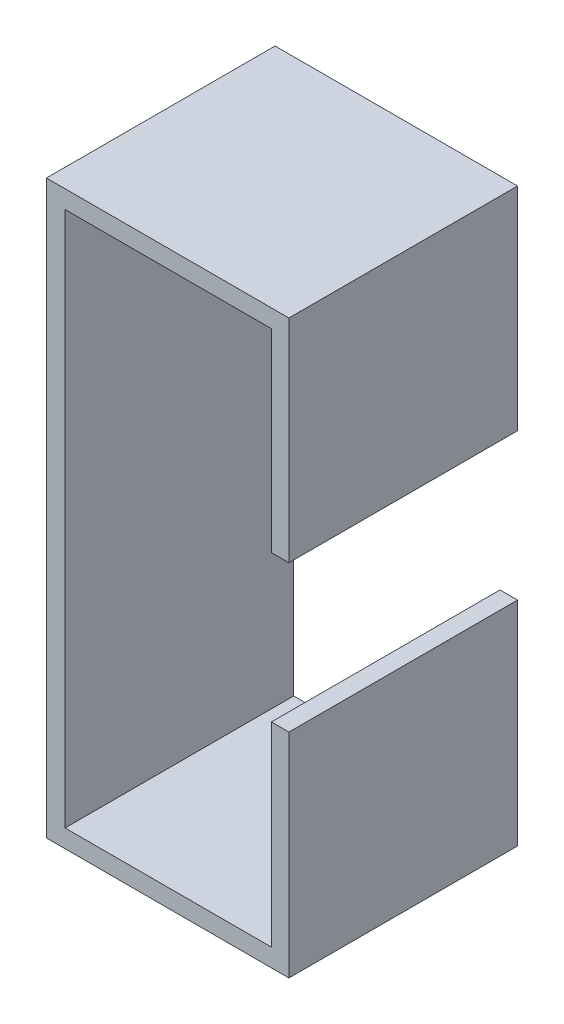
ISO-10303-21;
HEADER;
FILE_DESCRIPTION(('STEP AP214'),'2;1');
FILE_NAME('part.step','',(''),(''),'','','');
FILE_SCHEMA(('AUTOMOTIVE_DESIGN { 1 0 10303 214 1 1 1 1 }'));
ENDSEC;
DATA;
#1=APPLICATION_CONTEXT('core data for automotive mechanical design processes');
#2=APPLICATION_PROTOCOL_DEFINITION('international standard','automotive_design',2000,#1);
#3=PRODUCT_CONTEXT('',#1,'mechanical');
#4=PRODUCT('Part','Part','',(#3));
#5=PRODUCT_RELATED_PRODUCT_CATEGORY('part','',(#4));
#6=PRODUCT_DEFINITION_FORMATION('','',#4);
#7=PRODUCT_DEFINITION_CONTEXT('part definition',#1,'design');
#8=PRODUCT_DEFINITION('design','',#6,#7);
#9=PRODUCT_DEFINITION_SHAPE('','',#8);
#10=(LENGTH_UNIT() NAMED_UNIT(*) SI_UNIT(.MILLI.,.METRE.));
#11=(NAMED_UNIT(*) PLANE_ANGLE_UNIT() SI_UNIT($,.RADIAN.));
#12=(NAMED_UNIT(*) SI_UNIT($,.STERADIAN.) SOLID_ANGLE_UNIT());
#13=UNCERTAINTY_MEASURE_WITH_UNIT(LENGTH_MEASURE(1.E-05),#10,'distance_accuracy_value','');
#14=(GEOMETRIC_REPRESENTATION_CONTEXT(3) GLOBAL_UNCERTAINTY_ASSIGNED_CONTEXT((#13)) GLOBAL_UNIT_ASSIGNED_CONTEXT((#10,
#11,#12)) REPRESENTATION_CONTEXT('',''));
#15=CARTESIAN_POINT('',(0.,0.,0.));
#16=DIRECTION('',(0.,0.,1.));
#17=DIRECTION('',(1.,0.,0.));
#18=AXIS2_PLACEMENT_3D('',#15,#16,#17);
#19=CARTESIAN_POINT('',(4.2418,2.58320032,7.99999924));
#20=DIRECTION('',(0.,0.,-1.));
#21=DIRECTION('',(0.,-1.,0.));
#22=AXIS2_PLACEMENT_3D('',#19,#20,#21);
#23=PLANE('',#22);
#24=DIRECTION('',(0.,1.,0.));
#25=VECTOR('',#24,1.);
#26=CARTESIAN_POINT('',(4.2418,2.58320032,7.99999924));
#27=LINE('',#26,#25);
#28=CARTESIAN_POINT('',(4.2418,2.58320032,7.99999924));
#29=VERTEX_POINT('',#28);
#30=CARTESIAN_POINT('',(4.2418,10.00000032,7.99999924));
#31=VERTEX_POINT('',#30);
#32=EDGE_CURVE('E20',#29,#31,#27,.T.);
#33=ORIENTED_EDGE('',*,*,#32,.T.);
#34=DIRECTION('',(-1.,0.,0.));
#35=VECTOR('',#34,1.);
#36=CARTESIAN_POINT('',(4.2418,10.00000032,7.99999924));
#37=LINE('',#36,#35);
#38=CARTESIAN_POINT('',(-4.2418,10.00000032,7.99999924));
#39=VERTEX_POINT('',#38);
#40=EDGE_CURVE('E216',#31,#39,#37,.T.);
#41=ORIENTED_EDGE('',*,*,#40,.T.);
#42=DIRECTION('',(0.,-1.,0.));
#43=VECTOR('',#42,1.);
#44=CARTESIAN_POINT('',(-4.2418,10.00000032,7.99999924));
#45=LINE('',#44,#43);
#46=CARTESIAN_POINT('',(-4.2418,-10.00000032,7.99999924));
#47=VERTEX_POINT('',#46);
#48=EDGE_CURVE('E248',#39,#47,#45,.T.);
#49=ORIENTED_EDGE('',*,*,#48,.T.);
#50=DIRECTION('',(1.,0.,0.));
#51=VECTOR('',#50,1.);
#52=CARTESIAN_POINT('',(-4.2418,-10.00000032,7.99999924));
#53=LINE('',#52,#51);
#54=CARTESIAN_POINT('',(4.2418,-10.00000032,7.99999924));
#55=VERTEX_POINT('',#54);
#56=EDGE_CURVE('E122',#47,#55,#53,.T.);
#57=ORIENTED_EDGE('',*,*,#56,.T.);
#58=DIRECTION('',(0.,1.,0.));
#59=VECTOR('',#58,1.);
#60=CARTESIAN_POINT('',(4.2418,-10.00000032,7.99999924));
#61=LINE('',#60,#59);
#62=CARTESIAN_POINT('',(4.2418,-2.54759968,7.99999924));
#63=VERTEX_POINT('',#62);
#64=EDGE_CURVE('E146',#55,#63,#61,.T.);
#65=ORIENTED_EDGE('',*,*,#64,.T.);
#66=DIRECTION('',(-1.,0.,0.));
#67=VECTOR('',#66,1.);
#68=CARTESIAN_POINT('',(4.2418,-2.54759968,7.99999924));
#69=LINE('',#68,#67);
#70=CARTESIAN_POINT('',(3.6281995,-2.54759968,7.99999924));
#71=VERTEX_POINT('',#70);
#72=EDGE_CURVE('E152',#63,#71,#69,.T.);
#73=ORIENTED_EDGE('',*,*,#72,.T.);
#74=DIRECTION('',(0.,-1.,0.));
#75=VECTOR('',#74,1.);
#76=CARTESIAN_POINT('',(3.6281995,-2.54759968,7.99999924));
#77=LINE('',#76,#75);
#78=CARTESIAN_POINT('',(3.6281995,-9.36999904,7.99999924));
#79=VERTEX_POINT('',#78);
#80=EDGE_CURVE('E180',#71,#79,#77,.T.);
#81=ORIENTED_EDGE('',*,*,#80,.T.);
#82=DIRECTION('',(-1.,0.,0.));
#83=VECTOR('',#82,1.);
#84=CARTESIAN_POINT('',(3.6281995,-9.36999904,7.99999924));
#85=LINE('',#84,#83);
#86=CARTESIAN_POINT('',(-3.59179876,-9.36999904,7.99999924));
#87=VERTEX_POINT('',#86);
#88=EDGE_CURVE('E205',#79,#87,#85,.T.);
#89=ORIENTED_EDGE('',*,*,#88,.T.);
#90=DIRECTION('',(0.,1.,0.));
#91=VECTOR('',#90,1.);
#92=CARTESIAN_POINT('',(-3.59179876,-9.36999904,7.99999924));
#93=LINE('',#92,#91);
#94=CARTESIAN_POINT('',(-3.59179876,9.37000158,7.99999924));
#95=VERTEX_POINT('',#94);
#96=EDGE_CURVE('E172',#87,#95,#93,.T.);
#97=ORIENTED_EDGE('',*,*,#96,.T.);
#98=DIRECTION('',(0.999999999999938,-3.51800638383679E-07,0.));
#99=VECTOR('',#98,1.);
#100=CARTESIAN_POINT('',(-3.59179876,9.37000158,7.99999924));
#101=LINE('',#100,#99);
#102=CARTESIAN_POINT('',(3.6281995,9.36999904,7.99999924));
#103=VERTEX_POINT('',#102);
#104=EDGE_CURVE('E233',#95,#103,#101,.T.);
#105=ORIENTED_EDGE('',*,*,#104,.T.);
#106=DIRECTION('',(0.,-1.,0.));
#107=VECTOR('',#106,1.);
#108=CARTESIAN_POINT('',(3.6281995,9.36999904,7.99999924));
#109=LINE('',#108,#107);
#110=CARTESIAN_POINT('',(3.6281995,2.58320032,7.99999924));
#111=VERTEX_POINT('',#110);
#112=EDGE_CURVE('E183',#103,#111,#109,.T.);
#113=ORIENTED_EDGE('',*,*,#112,.T.);
#114=DIRECTION('',(1.,0.,0.));
#115=VECTOR('',#114,1.);
#116=CARTESIAN_POINT('',(3.6281995,2.58320032,7.99999924));
#117=LINE('',#116,#115);
#118=EDGE_CURVE('E11',#111,#29,#117,.T.);
#119=ORIENTED_EDGE('',*,*,#118,.T.);
#120=EDGE_LOOP('',(#33,#41,#49,#57,#65,#73,#81,#89,#97,#105,#113,#119));
#121=FACE_BOUND('',#120,.T.);
#122=ADVANCED_FACE('F16',(#121),#23,.F.);
#123=CARTESIAN_POINT('',(4.2418,2.58320032,0.));
#124=DIRECTION('',(0.,0.,-1.));
#125=DIRECTION('',(0.,-1.,0.));
#126=AXIS2_PLACEMENT_3D('',#123,#124,#125);
#127=PLANE('',#126);
#128=DIRECTION('',(1.,0.,0.));
#129=VECTOR('',#128,1.);
#130=CARTESIAN_POINT('',(3.6281995,2.58320032,0.));
#131=LINE('',#130,#129);
#132=CARTESIAN_POINT('',(3.6281995,2.58320032,0.));
#133=VERTEX_POINT('',#132);
#134=CARTESIAN_POINT('',(4.2418,2.58320032,0.));
#135=VERTEX_POINT('',#134);
#136=EDGE_CURVE('E27',#133,#135,#131,.T.);
#137=ORIENTED_EDGE('',*,*,#136,.F.);
#138=DIRECTION('',(0.,-1.,0.));
#139=VECTOR('',#138,1.);
#140=CARTESIAN_POINT('',(3.6281995,9.36999904,0.));
#141=LINE('',#140,#139);
#142=CARTESIAN_POINT('',(3.6281995,9.36999904,0.));
#143=VERTEX_POINT('',#142);
#144=EDGE_CURVE('E196',#143,#133,#141,.T.);
#145=ORIENTED_EDGE('',*,*,#144,.F.);
#146=DIRECTION('',(0.999999999999938,-3.51800638383679E-07,0.));
#147=VECTOR('',#146,1.);
#148=CARTESIAN_POINT('',(-3.59179876,9.37000158,0.));
#149=LINE('',#148,#147);
#150=CARTESIAN_POINT('',(-3.59179876,9.37000158,0.));
#151=VERTEX_POINT('',#150);
#152=EDGE_CURVE('E220',#151,#143,#149,.T.);
#153=ORIENTED_EDGE('',*,*,#152,.F.);
#154=DIRECTION('',(0.,1.,0.));
#155=VECTOR('',#154,1.);
#156=CARTESIAN_POINT('',(-3.59179876,-9.36999904,0.));
#157=LINE('',#156,#155);
#158=CARTESIAN_POINT('',(-3.59179876,-9.36999904,0.));
#159=VERTEX_POINT('',#158);
#160=EDGE_CURVE('E173',#159,#151,#157,.T.);
#161=ORIENTED_EDGE('',*,*,#160,.F.);
#162=DIRECTION('',(-1.,0.,0.));
#163=VECTOR('',#162,1.);
#164=CARTESIAN_POINT('',(3.6281995,-9.36999904,0.));
#165=LINE('',#164,#163);
#166=CARTESIAN_POINT('',(3.6281995,-9.36999904,0.));
#167=VERTEX_POINT('',#166);
#168=EDGE_CURVE('E176',#167,#159,#165,.T.);
#169=ORIENTED_EDGE('',*,*,#168,.F.);
#170=DIRECTION('',(0.,-1.,0.));
#171=VECTOR('',#170,1.);
#172=CARTESIAN_POINT('',(3.6281995,-2.54759968,0.));
#173=LINE('',#172,#171);
#174=CARTESIAN_POINT('',(3.6281995,-2.54759968,0.));
#175=VERTEX_POINT('',#174);
#176=EDGE_CURVE('E140',#175,#167,#173,.T.);
#177=ORIENTED_EDGE('',*,*,#176,.F.);
#178=DIRECTION('',(-1.,0.,0.));
#179=VECTOR('',#178,1.);
#180=CARTESIAN_POINT('',(4.2418,-2.54759968,0.));
#181=LINE('',#180,#179);
#182=CARTESIAN_POINT('',(4.2418,-2.54759968,0.));
#183=VERTEX_POINT('',#182);
#184=EDGE_CURVE('E136',#183,#175,#181,.T.);
#185=ORIENTED_EDGE('',*,*,#184,.F.);
#186=DIRECTION('',(0.,1.,0.));
#187=VECTOR('',#186,1.);
#188=CARTESIAN_POINT('',(4.2418,-10.00000032,0.));
#189=LINE('',#188,#187);
#190=CARTESIAN_POINT('',(4.2418,-10.00000032,0.));
#191=VERTEX_POINT('',#190);
#192=EDGE_CURVE('E110',#191,#183,#189,.T.);
#193=ORIENTED_EDGE('',*,*,#192,.F.);
#194=DIRECTION('',(1.,0.,0.));
#195=VECTOR('',#194,1.);
#196=CARTESIAN_POINT('',(-4.2418,-10.00000032,0.));
#197=LINE('',#196,#195);
#198=CARTESIAN_POINT('',(-4.2418,-10.00000032,0.));
#199=VERTEX_POINT('',#198);
#200=EDGE_CURVE('E229',#199,#191,#197,.T.);
#201=ORIENTED_EDGE('',*,*,#200,.F.);
#202=DIRECTION('',(0.,-1.,0.));
#203=VECTOR('',#202,1.);
#204=CARTESIAN_POINT('',(-4.2418,10.00000032,0.));
#205=LINE('',#204,#203);
#206=CARTESIAN_POINT('',(-4.2418,10.00000032,0.));
#207=VERTEX_POINT('',#206);
#208=EDGE_CURVE('E255',#207,#199,#205,.T.);
#209=ORIENTED_EDGE('',*,*,#208,.F.);
#210=DIRECTION('',(-1.,0.,0.));
#211=VECTOR('',#210,1.);
#212=CARTESIAN_POINT('',(4.2418,10.00000032,0.));
#213=LINE('',#212,#211);
#214=CARTESIAN_POINT('',(4.2418,10.00000032,0.));
#215=VERTEX_POINT('',#214);
#216=EDGE_CURVE('E204',#215,#207,#213,.T.);
#217=ORIENTED_EDGE('',*,*,#216,.F.);
#218=DIRECTION('',(0.,1.,0.));
#219=VECTOR('',#218,1.);
#220=CARTESIAN_POINT('',(4.2418,2.58320032,0.));
#221=LINE('',#220,#219);
#222=EDGE_CURVE('E243',#135,#215,#221,.T.);
#223=ORIENTED_EDGE('',*,*,#222,.F.);
#224=EDGE_LOOP('',(#137,#145,#153,#161,#169,#177,#185,#193,#201,#209,#217,#223));
#225=FACE_BOUND('',#224,.T.);
#226=ADVANCED_FACE('F138',(#225),#127,.T.);
#227=CARTESIAN_POINT('',(3.6281995,2.58320032,0.));
#228=DIRECTION('',(0.,1.,0.));
#229=DIRECTION('',(1.,0.,0.));
#230=AXIS2_PLACEMENT_3D('',#227,#228,#229);
#231=PLANE('',#230);
#232=ORIENTED_EDGE('',*,*,#136,.T.);
#233=DIRECTION('',(0.,0.,1.));
#234=VECTOR('',#233,1.);
#235=CARTESIAN_POINT('',(4.2418,2.58320032,0.));
#236=LINE('',#235,#234);
#237=EDGE_CURVE('E201',#135,#29,#236,.T.);
#238=ORIENTED_EDGE('',*,*,#237,.T.);
#239=ORIENTED_EDGE('',*,*,#118,.F.);
#240=DIRECTION('',(0.,0.,1.));
#241=VECTOR('',#240,1.);
#242=CARTESIAN_POINT('',(3.6281995,2.58320032,0.));
#243=LINE('',#242,#241);
#244=EDGE_CURVE('E188',#133,#111,#243,.T.);
#245=ORIENTED_EDGE('',*,*,#244,.F.);
#246=EDGE_LOOP('',(#232,#238,#239,#245));
#247=FACE_BOUND('',#246,.T.);
#248=ADVANCED_FACE('F323',(#247),#231,.F.);
#249=CARTESIAN_POINT('',(3.6281995,9.36999904,0.));
#250=DIRECTION('',(1.,0.,0.));
#251=DIRECTION('',(0.,1.,0.));
#252=AXIS2_PLACEMENT_3D('',#249,#250,#251);
#253=PLANE('',#252);
#254=ORIENTED_EDGE('',*,*,#144,.T.);
#255=ORIENTED_EDGE('',*,*,#244,.T.);
#256=ORIENTED_EDGE('',*,*,#112,.F.);
#257=DIRECTION('',(0.,0.,1.));
#258=VECTOR('',#257,1.);
#259=CARTESIAN_POINT('',(3.6281995,9.36999904,0.));
#260=LINE('',#259,#258);
#261=EDGE_CURVE('E224',#143,#103,#260,.T.);
#262=ORIENTED_EDGE('',*,*,#261,.F.);
#263=EDGE_LOOP('',(#254,#255,#256,#262));
#264=FACE_BOUND('',#263,.T.);
#265=ADVANCED_FACE('F278',(#264),#253,.F.);
#266=CARTESIAN_POINT('',(-3.59179876,9.37000158,0.));
#267=DIRECTION('',(3.51800638383679E-07,0.999999999999938,0.));
#268=DIRECTION('',(0.,0.,-1.));
#269=AXIS2_PLACEMENT_3D('',#266,#267,#268);
#270=PLANE('',#269);
#271=ORIENTED_EDGE('',*,*,#152,.T.);
#272=ORIENTED_EDGE('',*,*,#261,.T.);
#273=ORIENTED_EDGE('',*,*,#104,.F.);
#274=DIRECTION('',(0.,0.,1.));
#275=VECTOR('',#274,1.);
#276=CARTESIAN_POINT('',(-3.59179876,9.37000158,0.));
#277=LINE('',#276,#275);
#278=EDGE_CURVE('E168',#151,#95,#277,.T.);
#279=ORIENTED_EDGE('',*,*,#278,.F.);
#280=EDGE_LOOP('',(#271,#272,#273,#279));
#281=FACE_BOUND('',#280,.T.);
#282=ADVANCED_FACE('F274',(#281),#270,.F.);
#283=CARTESIAN_POINT('',(-3.59179876,-9.36999904,0.));
#284=DIRECTION('',(-1.,0.,0.));
#285=DIRECTION('',(0.,0.,1.));
#286=AXIS2_PLACEMENT_3D('',#283,#284,#285);
#287=PLANE('',#286);
#288=ORIENTED_EDGE('',*,*,#160,.T.);
#289=ORIENTED_EDGE('',*,*,#278,.T.);
#290=ORIENTED_EDGE('',*,*,#96,.F.);
#291=DIRECTION('',(0.,0.,1.));
#292=VECTOR('',#291,1.);
#293=CARTESIAN_POINT('',(-3.59179876,-9.36999904,0.));
#294=LINE('',#293,#292);
#295=EDGE_CURVE('E179',#159,#87,#294,.T.);
#296=ORIENTED_EDGE('',*,*,#295,.F.);
#297=EDGE_LOOP('',(#288,#289,#290,#296));
#298=FACE_BOUND('',#297,.T.);
#299=ADVANCED_FACE('F284',(#298),#287,.F.);
#300=CARTESIAN_POINT('',(3.6281995,-9.36999904,0.));
#301=DIRECTION('',(0.,-1.,0.));
#302=DIRECTION('',(0.,0.,-1.));
#303=AXIS2_PLACEMENT_3D('',#300,#301,#302);
#304=PLANE('',#303);
#305=ORIENTED_EDGE('',*,*,#168,.T.);
#306=ORIENTED_EDGE('',*,*,#295,.T.);
#307=ORIENTED_EDGE('',*,*,#88,.F.);
#308=DIRECTION('',(0.,0.,1.));
#309=VECTOR('',#308,1.);
#310=CARTESIAN_POINT('',(3.6281995,-9.36999904,0.));
#311=LINE('',#310,#309);
#312=EDGE_CURVE('E239',#167,#79,#311,.T.);
#313=ORIENTED_EDGE('',*,*,#312,.F.);
#314=EDGE_LOOP('',(#305,#306,#307,#313));
#315=FACE_BOUND('',#314,.T.);
#316=ADVANCED_FACE('F18',(#315),#304,.F.);
#317=CARTESIAN_POINT('',(3.6281995,-2.54759968,0.));
#318=DIRECTION('',(1.,0.,0.));
#319=DIRECTION('',(0.,1.,0.));
#320=AXIS2_PLACEMENT_3D('',#317,#318,#319);
#321=PLANE('',#320);
#322=ORIENTED_EDGE('',*,*,#176,.T.);
#323=ORIENTED_EDGE('',*,*,#312,.T.);
#324=ORIENTED_EDGE('',*,*,#80,.F.);
#325=DIRECTION('',(0.,0.,1.));
#326=VECTOR('',#325,1.);
#327=CARTESIAN_POINT('',(3.6281995,-2.54759968,0.));
#328=LINE('',#327,#326);
#329=EDGE_CURVE('E145',#175,#71,#328,.T.);
#330=ORIENTED_EDGE('',*,*,#329,.F.);
#331=EDGE_LOOP('',(#322,#323,#324,#330));
#332=FACE_BOUND('',#331,.T.);
#333=ADVANCED_FACE('F382',(#332),#321,.F.);
#334=CARTESIAN_POINT('',(4.2418,-2.54759968,0.));
#335=DIRECTION('',(0.,-1.,0.));
#336=DIRECTION('',(0.,0.,-1.));
#337=AXIS2_PLACEMENT_3D('',#334,#335,#336);
#338=PLANE('',#337);
#339=ORIENTED_EDGE('',*,*,#184,.T.);
#340=ORIENTED_EDGE('',*,*,#329,.T.);
#341=ORIENTED_EDGE('',*,*,#72,.F.);
#342=DIRECTION('',(0.,0.,1.));
#343=VECTOR('',#342,1.);
#344=CARTESIAN_POINT('',(4.2418,-2.54759968,0.));
#345=LINE('',#344,#343);
#346=EDGE_CURVE('E149',#183,#63,#345,.T.);
#347=ORIENTED_EDGE('',*,*,#346,.F.);
#348=EDGE_LOOP('',(#339,#340,#341,#347));
#349=FACE_BOUND('',#348,.T.);
#350=ADVANCED_FACE('F150',(#349),#338,.F.);
#351=CARTESIAN_POINT('',(4.2418,-10.00000032,0.));
#352=DIRECTION('',(-1.,0.,0.));
#353=DIRECTION('',(0.,0.,1.));
#354=AXIS2_PLACEMENT_3D('',#351,#352,#353);
#355=PLANE('',#354);
#356=ORIENTED_EDGE('',*,*,#192,.T.);
#357=ORIENTED_EDGE('',*,*,#346,.T.);
#358=ORIENTED_EDGE('',*,*,#64,.F.);
#359=DIRECTION('',(0.,0.,1.));
#360=VECTOR('',#359,1.);
#361=CARTESIAN_POINT('',(4.2418,-10.00000032,0.));
#362=LINE('',#361,#360);
#363=EDGE_CURVE('E158',#191,#55,#362,.T.);
#364=ORIENTED_EDGE('',*,*,#363,.F.);
#365=EDGE_LOOP('',(#356,#357,#358,#364));
#366=FACE_BOUND('',#365,.T.);
#367=ADVANCED_FACE('F157',(#366),#355,.F.);
#368=CARTESIAN_POINT('',(-4.2418,-10.00000032,0.));
#369=DIRECTION('',(0.,1.,0.));
#370=DIRECTION('',(1.,0.,0.));
#371=AXIS2_PLACEMENT_3D('',#368,#369,#370);
#372=PLANE('',#371);
#373=ORIENTED_EDGE('',*,*,#200,.T.);
#374=ORIENTED_EDGE('',*,*,#363,.T.);
#375=ORIENTED_EDGE('',*,*,#56,.F.);
#376=DIRECTION('',(0.,0.,1.));
#377=VECTOR('',#376,1.);
#378=CARTESIAN_POINT('',(-4.2418,-10.00000032,0.));
#379=LINE('',#378,#377);
#380=EDGE_CURVE('E251',#199,#47,#379,.T.);
#381=ORIENTED_EDGE('',*,*,#380,.F.);
#382=EDGE_LOOP('',(#373,#374,#375,#381));
#383=FACE_BOUND('',#382,.T.);
#384=ADVANCED_FACE('F308',(#383),#372,.F.);
#385=CARTESIAN_POINT('',(-4.2418,10.00000032,0.));
#386=DIRECTION('',(1.,0.,0.));
#387=DIRECTION('',(0.,1.,0.));
#388=AXIS2_PLACEMENT_3D('',#385,#386,#387);
#389=PLANE('',#388);
#390=ORIENTED_EDGE('',*,*,#208,.T.);
#391=ORIENTED_EDGE('',*,*,#380,.T.);
#392=ORIENTED_EDGE('',*,*,#48,.F.);
#393=DIRECTION('',(0.,0.,1.));
#394=VECTOR('',#393,1.);
#395=CARTESIAN_POINT('',(-4.2418,10.00000032,0.));
#396=LINE('',#395,#394);
#397=EDGE_CURVE('E212',#207,#39,#396,.T.);
#398=ORIENTED_EDGE('',*,*,#397,.F.);
#399=EDGE_LOOP('',(#390,#391,#392,#398));
#400=FACE_BOUND('',#399,.T.);
#401=ADVANCED_FACE('F307',(#400),#389,.F.);
#402=CARTESIAN_POINT('',(4.2418,10.00000032,0.));
#403=DIRECTION('',(0.,-1.,0.));
#404=DIRECTION('',(0.,0.,-1.));
#405=AXIS2_PLACEMENT_3D('',#402,#403,#404);
#406=PLANE('',#405);
#407=ORIENTED_EDGE('',*,*,#216,.T.);
#408=ORIENTED_EDGE('',*,*,#397,.T.);
#409=ORIENTED_EDGE('',*,*,#40,.F.);
#410=DIRECTION('',(0.,0.,1.));
#411=VECTOR('',#410,1.);
#412=CARTESIAN_POINT('',(4.2418,10.00000032,0.));
#413=LINE('',#412,#411);
#414=EDGE_CURVE('E247',#215,#31,#413,.T.);
#415=ORIENTED_EDGE('',*,*,#414,.F.);
#416=EDGE_LOOP('',(#407,#408,#409,#415));
#417=FACE_BOUND('',#416,.T.);
#418=ADVANCED_FACE('F304',(#417),#406,.F.);
#419=CARTESIAN_POINT('',(4.2418,2.58320032,0.));
#420=DIRECTION('',(-1.,0.,0.));
#421=DIRECTION('',(0.,0.,1.));
#422=AXIS2_PLACEMENT_3D('',#419,#420,#421);
#423=PLANE('',#422);
#424=ORIENTED_EDGE('',*,*,#222,.T.);
#425=ORIENTED_EDGE('',*,*,#414,.T.);
#426=ORIENTED_EDGE('',*,*,#32,.F.);
#427=ORIENTED_EDGE('',*,*,#237,.F.);
#428=EDGE_LOOP('',(#424,#425,#426,#427));
#429=FACE_BOUND('',#428,.T.);
#430=ADVANCED_FACE('F301',(#429),#423,.F.);
#431=CLOSED_SHELL('',(#122,#226,#248,#265,#282,#299,#316,#333,#350,#367,#384,#401,#418,#430));
#432=MANIFOLD_SOLID_BREP('B1',#431);
#433=ADVANCED_BREP_SHAPE_REPRESENTATION('',(#18,#432),#14);
#434=SHAPE_DEFINITION_REPRESENTATION(#9,#433);
ENDSEC;
END-ISO-10303-21;
